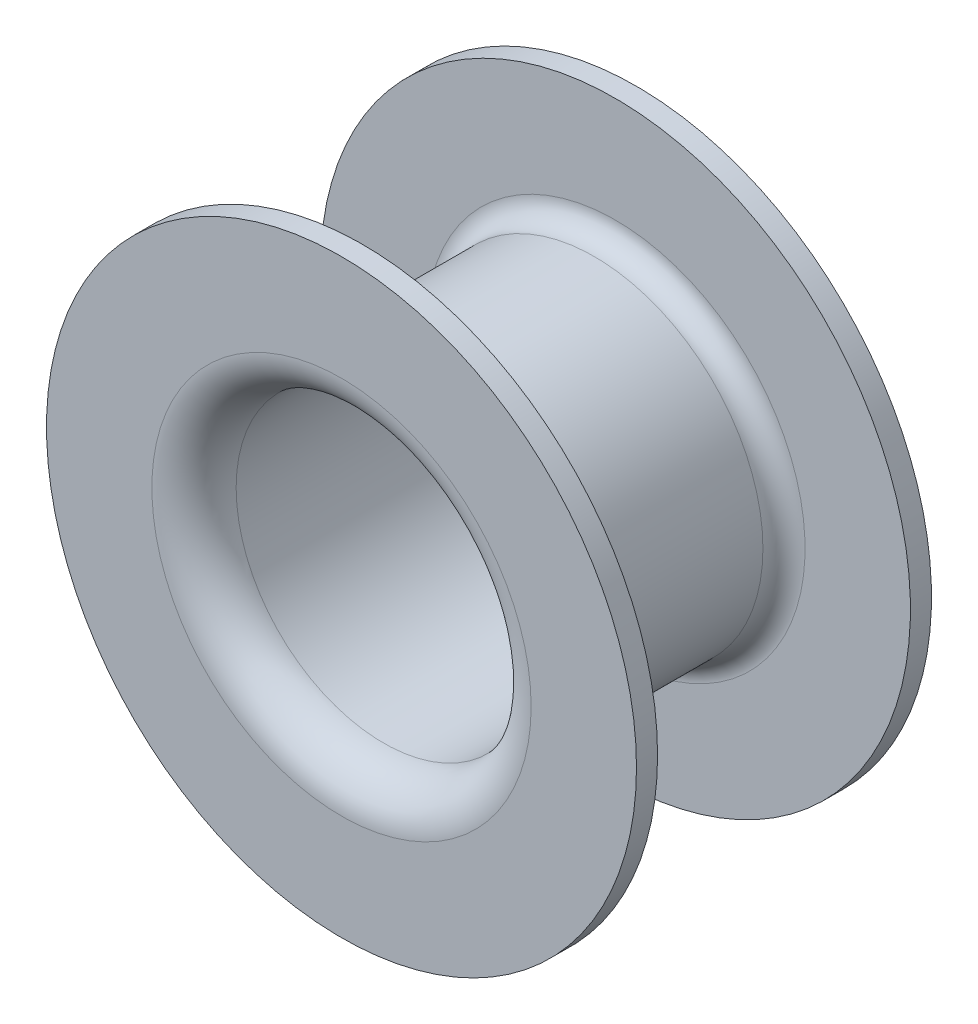
ISO-10303-21;
HEADER;
FILE_DESCRIPTION(('STEP AP214'),'2;1');
FILE_NAME('part.step','',(''),(''),'','','');
FILE_SCHEMA(('AUTOMOTIVE_DESIGN { 1 0 10303 214 1 1 1 1 }'));
ENDSEC;
DATA;
#1=APPLICATION_CONTEXT('core data for automotive mechanical design processes');
#2=APPLICATION_PROTOCOL_DEFINITION('international standard','automotive_design',2000,#1);
#3=PRODUCT_CONTEXT('',#1,'mechanical');
#4=PRODUCT('Part','Part','',(#3));
#5=PRODUCT_RELATED_PRODUCT_CATEGORY('part','',(#4));
#6=PRODUCT_DEFINITION_FORMATION('','',#4);
#7=PRODUCT_DEFINITION_CONTEXT('part definition',#1,'design');
#8=PRODUCT_DEFINITION('design','',#6,#7);
#9=PRODUCT_DEFINITION_SHAPE('','',#8);
#10=(LENGTH_UNIT() NAMED_UNIT(*) SI_UNIT(.MILLI.,.METRE.));
#11=(NAMED_UNIT(*) PLANE_ANGLE_UNIT() SI_UNIT($,.RADIAN.));
#12=(NAMED_UNIT(*) SI_UNIT($,.STERADIAN.) SOLID_ANGLE_UNIT());
#13=UNCERTAINTY_MEASURE_WITH_UNIT(LENGTH_MEASURE(1.E-05),#10,'distance_accuracy_value','');
#14=(GEOMETRIC_REPRESENTATION_CONTEXT(3) GLOBAL_UNCERTAINTY_ASSIGNED_CONTEXT((#13)) GLOBAL_UNIT_ASSIGNED_CONTEXT((#10,
#11,#12)) REPRESENTATION_CONTEXT('',''));
#15=CARTESIAN_POINT('',(0.,0.,0.));
#16=DIRECTION('',(0.,0.,1.));
#17=DIRECTION('',(1.,0.,0.));
#18=AXIS2_PLACEMENT_3D('',#15,#16,#17);
#19=CARTESIAN_POINT('',(0.,0.,0.));
#20=DIRECTION('',(0.,0.,1.));
#21=DIRECTION('',(1.,0.,0.));
#22=AXIS2_PLACEMENT_3D('',#19,#20,#21);
#23=PLANE('',#22);
#24=CARTESIAN_POINT('',(0.,0.,0.));
#25=DIRECTION('',(0.,0.,1.));
#26=DIRECTION('',(1.,0.,0.));
#27=AXIS2_PLACEMENT_3D('',#24,#25,#26);
#28=CIRCLE('',#27,2.25);
#29=CARTESIAN_POINT('',(2.25,0.,0.));
#30=VERTEX_POINT('',#29);
#31=EDGE_CURVE('E49',#30,#30,#28,.T.);
#32=ORIENTED_EDGE('',*,*,#31,.T.);
#33=EDGE_LOOP('',(#32));
#34=FACE_BOUND('',#33,.T.);
#35=CARTESIAN_POINT('',(0.,0.,0.));
#36=DIRECTION('',(0.,0.,1.));
#37=DIRECTION('',(1.,0.,0.));
#38=AXIS2_PLACEMENT_3D('',#35,#36,#37);
#39=CIRCLE('',#38,3.5);
#40=CARTESIAN_POINT('',(3.5,0.,0.));
#41=VERTEX_POINT('',#40);
#42=EDGE_CURVE('E62',#41,#41,#39,.T.);
#43=ORIENTED_EDGE('',*,*,#42,.F.);
#44=EDGE_LOOP('',(#43));
#45=FACE_BOUND('',#44,.T.);
#46=ADVANCED_FACE('F29',(#34,#45),#23,.F.);
#47=CARTESIAN_POINT('',(0.,0.,0.25));
#48=DIRECTION('',(0.,0.,1.));
#49=DIRECTION('',(1.,0.,0.));
#50=AXIS2_PLACEMENT_3D('',#47,#48,#49);
#51=PLANE('',#50);
#52=CARTESIAN_POINT('',(0.,0.,0.25));
#53=DIRECTION('',(0.,0.,1.));
#54=DIRECTION('',(1.,0.,0.));
#55=AXIS2_PLACEMENT_3D('',#52,#53,#54);
#56=CIRCLE('',#55,2.25);
#57=CARTESIAN_POINT('',(2.25,0.,0.25));
#58=VERTEX_POINT('',#57);
#59=EDGE_CURVE('E36',#58,#58,#56,.F.);
#60=ORIENTED_EDGE('',*,*,#59,.T.);
#61=EDGE_LOOP('',(#60));
#62=FACE_BOUND('',#61,.T.);
#63=CARTESIAN_POINT('',(0.,0.,0.25));
#64=DIRECTION('',(0.,0.,1.));
#65=DIRECTION('',(1.,0.,0.));
#66=AXIS2_PLACEMENT_3D('',#63,#64,#65);
#67=CIRCLE('',#66,3.5);
#68=CARTESIAN_POINT('',(3.5,0.,0.25));
#69=VERTEX_POINT('',#68);
#70=EDGE_CURVE('E61',#69,#69,#67,.T.);
#71=ORIENTED_EDGE('',*,*,#70,.T.);
#72=EDGE_LOOP('',(#71));
#73=FACE_BOUND('',#72,.T.);
#74=ADVANCED_FACE('F97',(#62,#73),#51,.T.);
#75=CARTESIAN_POINT('',(0.,0.,0.25));
#76=DIRECTION('',(0.,0.,-1.));
#77=DIRECTION('',(-1.,0.,0.));
#78=AXIS2_PLACEMENT_3D('',#75,#76,#77);
#79=CYLINDRICAL_SURFACE('',#78,3.5);
#80=ORIENTED_EDGE('',*,*,#70,.F.);
#81=EDGE_LOOP('',(#80));
#82=FACE_BOUND('',#81,.T.);
#83=ORIENTED_EDGE('',*,*,#42,.T.);
#84=EDGE_LOOP('',(#83));
#85=FACE_BOUND('',#84,.T.);
#86=ADVANCED_FACE('F103',(#82,#85),#79,.T.);
#87=CARTESIAN_POINT('',(0.,0.,0.25));
#88=DIRECTION('',(0.,0.,-1.));
#89=DIRECTION('',(-1.,0.,0.));
#90=AXIS2_PLACEMENT_3D('',#87,#88,#89);
#91=CYLINDRICAL_SURFACE('',#90,1.75);
#92=CARTESIAN_POINT('',(0.,0.,-0.25));
#93=DIRECTION('',(0.,0.,1.));
#94=DIRECTION('',(1.,0.,0.));
#95=AXIS2_PLACEMENT_3D('',#92,#93,#94);
#96=CIRCLE('',#95,1.75);
#97=CARTESIAN_POINT('',(1.75,0.,-0.25));
#98=VERTEX_POINT('',#97);
#99=EDGE_CURVE('E40',#98,#98,#96,.T.);
#100=ORIENTED_EDGE('',*,*,#99,.T.);
#101=EDGE_LOOP('',(#100));
#102=FACE_BOUND('',#101,.T.);
#103=CARTESIAN_POINT('',(0.,0.,-2.75));
#104=DIRECTION('',(0.,0.,-1.));
#105=DIRECTION('',(-1.,0.,0.));
#106=AXIS2_PLACEMENT_3D('',#103,#104,#105);
#107=CIRCLE('',#106,1.75);
#108=CARTESIAN_POINT('',(-1.75,0.,-2.75));
#109=VERTEX_POINT('',#108);
#110=EDGE_CURVE('E44',#109,#109,#107,.T.);
#111=ORIENTED_EDGE('',*,*,#110,.T.);
#112=EDGE_LOOP('',(#111));
#113=FACE_BOUND('',#112,.T.);
#114=ADVANCED_FACE('F93',(#102,#113),#91,.F.);
#115=CARTESIAN_POINT('',(0.,0.,-3.));
#116=DIRECTION('',(0.,0.,1.));
#117=DIRECTION('',(1.,0.,0.));
#118=AXIS2_PLACEMENT_3D('',#115,#116,#117);
#119=CYLINDRICAL_SURFACE('',#118,2.);
#120=CARTESIAN_POINT('',(0.,0.,-2.75));
#121=DIRECTION('',(0.,0.,-1.));
#122=DIRECTION('',(-1.,0.,0.));
#123=AXIS2_PLACEMENT_3D('',#120,#121,#122);
#124=CIRCLE('',#123,2.);
#125=CARTESIAN_POINT('',(-2.,0.,-2.75));
#126=VERTEX_POINT('',#125);
#127=EDGE_CURVE('E52',#126,#126,#124,.F.);
#128=ORIENTED_EDGE('',*,*,#127,.T.);
#129=EDGE_LOOP('',(#128));
#130=FACE_BOUND('',#129,.T.);
#131=CARTESIAN_POINT('',(0.,0.,-0.25));
#132=DIRECTION('',(0.,0.,1.));
#133=DIRECTION('',(1.,0.,0.));
#134=AXIS2_PLACEMENT_3D('',#131,#132,#133);
#135=CIRCLE('',#134,2.);
#136=CARTESIAN_POINT('',(2.,0.,-0.25));
#137=VERTEX_POINT('',#136);
#138=EDGE_CURVE('E55',#137,#137,#135,.F.);
#139=ORIENTED_EDGE('',*,*,#138,.T.);
#140=EDGE_LOOP('',(#139));
#141=FACE_BOUND('',#140,.T.);
#142=ADVANCED_FACE('F85',(#130,#141),#119,.T.);
#143=CARTESIAN_POINT('',(0.,0.,-3.));
#144=DIRECTION('',(0.,0.,-1.));
#145=DIRECTION('',(-1.,0.,0.));
#146=AXIS2_PLACEMENT_3D('',#143,#144,#145);
#147=PLANE('',#146);
#148=CARTESIAN_POINT('',(0.,0.,-3.));
#149=DIRECTION('',(0.,0.,-1.));
#150=DIRECTION('',(-1.,0.,0.));
#151=AXIS2_PLACEMENT_3D('',#148,#149,#150);
#152=CIRCLE('',#151,2.25);
#153=CARTESIAN_POINT('',(-2.25,0.,-3.));
#154=VERTEX_POINT('',#153);
#155=EDGE_CURVE('E58',#154,#154,#152,.T.);
#156=ORIENTED_EDGE('',*,*,#155,.T.);
#157=EDGE_LOOP('',(#156));
#158=FACE_BOUND('',#157,.T.);
#159=CARTESIAN_POINT('',(0.,0.,-3.));
#160=DIRECTION('',(0.,0.,-1.));
#161=DIRECTION('',(-1.,0.,0.));
#162=AXIS2_PLACEMENT_3D('',#159,#160,#161);
#163=CIRCLE('',#162,3.5);
#164=CARTESIAN_POINT('',(-3.5,0.,-3.));
#165=VERTEX_POINT('',#164);
#166=EDGE_CURVE('E68',#165,#165,#163,.T.);
#167=ORIENTED_EDGE('',*,*,#166,.F.);
#168=EDGE_LOOP('',(#167));
#169=FACE_BOUND('',#168,.T.);
#170=ADVANCED_FACE('F83',(#158,#169),#147,.F.);
#171=CARTESIAN_POINT('',(0.,0.,-3.25));
#172=DIRECTION('',(0.,0.,-1.));
#173=DIRECTION('',(-1.,0.,0.));
#174=AXIS2_PLACEMENT_3D('',#171,#172,#173);
#175=PLANE('',#174);
#176=CARTESIAN_POINT('',(0.,0.,-3.25));
#177=DIRECTION('',(0.,0.,-1.));
#178=DIRECTION('',(-1.,0.,0.));
#179=AXIS2_PLACEMENT_3D('',#176,#177,#178);
#180=CIRCLE('',#179,2.25);
#181=CARTESIAN_POINT('',(-2.25,0.,-3.25));
#182=VERTEX_POINT('',#181);
#183=EDGE_CURVE('E10',#182,#182,#180,.F.);
#184=ORIENTED_EDGE('',*,*,#183,.T.);
#185=EDGE_LOOP('',(#184));
#186=FACE_BOUND('',#185,.T.);
#187=CARTESIAN_POINT('',(0.,0.,-3.25));
#188=DIRECTION('',(0.,0.,-1.));
#189=DIRECTION('',(-1.,0.,0.));
#190=AXIS2_PLACEMENT_3D('',#187,#188,#189);
#191=CIRCLE('',#190,3.5);
#192=CARTESIAN_POINT('',(-3.5,0.,-3.25));
#193=VERTEX_POINT('',#192);
#194=EDGE_CURVE('E65',#193,#193,#191,.T.);
#195=ORIENTED_EDGE('',*,*,#194,.T.);
#196=EDGE_LOOP('',(#195));
#197=FACE_BOUND('',#196,.T.);
#198=ADVANCED_FACE('F74',(#186,#197),#175,.T.);
#199=CARTESIAN_POINT('',(0.,0.,-3.25));
#200=DIRECTION('',(0.,0.,1.));
#201=DIRECTION('',(1.,0.,0.));
#202=AXIS2_PLACEMENT_3D('',#199,#200,#201);
#203=CYLINDRICAL_SURFACE('',#202,3.5);
#204=ORIENTED_EDGE('',*,*,#194,.F.);
#205=EDGE_LOOP('',(#204));
#206=FACE_BOUND('',#205,.T.);
#207=ORIENTED_EDGE('',*,*,#166,.T.);
#208=EDGE_LOOP('',(#207));
#209=FACE_BOUND('',#208,.T.);
#210=ADVANCED_FACE('F76',(#206,#209),#203,.T.);
#211=CARTESIAN_POINT('',(0.,0.,-2.75));
#212=DIRECTION('',(0.,0.,-1.));
#213=DIRECTION('',(-1.,0.,0.));
#214=AXIS2_PLACEMENT_3D('',#211,#212,#213);
#215=TOROIDAL_SURFACE('',#214,2.25,0.25);
#216=ORIENTED_EDGE('',*,*,#127,.F.);
#217=EDGE_LOOP('',(#216));
#218=FACE_BOUND('',#217,.T.);
#219=ORIENTED_EDGE('',*,*,#155,.F.);
#220=EDGE_LOOP('',(#219));
#221=FACE_BOUND('',#220,.T.);
#222=ADVANCED_FACE('F79',(#218,#221),#215,.F.);
#223=CARTESIAN_POINT('',(0.,0.,-0.25));
#224=DIRECTION('',(0.,0.,1.));
#225=DIRECTION('',(1.,0.,0.));
#226=AXIS2_PLACEMENT_3D('',#223,#224,#225);
#227=TOROIDAL_SURFACE('',#226,2.25,0.25);
#228=ORIENTED_EDGE('',*,*,#31,.F.);
#229=EDGE_LOOP('',(#228));
#230=FACE_BOUND('',#229,.T.);
#231=ORIENTED_EDGE('',*,*,#138,.F.);
#232=EDGE_LOOP('',(#231));
#233=FACE_BOUND('',#232,.T.);
#234=ADVANCED_FACE('F113',(#230,#233),#227,.F.);
#235=CARTESIAN_POINT('',(0.,0.,-0.25));
#236=DIRECTION('',(0.,0.,1.));
#237=DIRECTION('',(1.,0.,0.));
#238=AXIS2_PLACEMENT_3D('',#235,#236,#237);
#239=TOROIDAL_SURFACE('',#238,2.25,0.5);
#240=ORIENTED_EDGE('',*,*,#59,.F.);
#241=EDGE_LOOP('',(#240));
#242=FACE_BOUND('',#241,.T.);
#243=ORIENTED_EDGE('',*,*,#99,.F.);
#244=EDGE_LOOP('',(#243));
#245=FACE_BOUND('',#244,.T.);
#246=ADVANCED_FACE('F116',(#242,#245),#239,.T.);
#247=CARTESIAN_POINT('',(0.,0.,-2.75));
#248=DIRECTION('',(0.,0.,-1.));
#249=DIRECTION('',(-1.,0.,0.));
#250=AXIS2_PLACEMENT_3D('',#247,#248,#249);
#251=TOROIDAL_SURFACE('',#250,2.25,0.5);
#252=ORIENTED_EDGE('',*,*,#183,.F.);
#253=EDGE_LOOP('',(#252));
#254=FACE_BOUND('',#253,.T.);
#255=ORIENTED_EDGE('',*,*,#110,.F.);
#256=EDGE_LOOP('',(#255));
#257=FACE_BOUND('',#256,.T.);
#258=ADVANCED_FACE('F31',(#254,#257),#251,.T.);
#259=CLOSED_SHELL('',(#46,#74,#86,#114,#142,#170,#198,#210,#222,#234,#246,#258));
#260=MANIFOLD_SOLID_BREP('B2',#259);
#261=ADVANCED_BREP_SHAPE_REPRESENTATION('',(#18,#260),#14);
#262=SHAPE_DEFINITION_REPRESENTATION(#9,#261);
ENDSEC;
END-ISO-10303-21;
